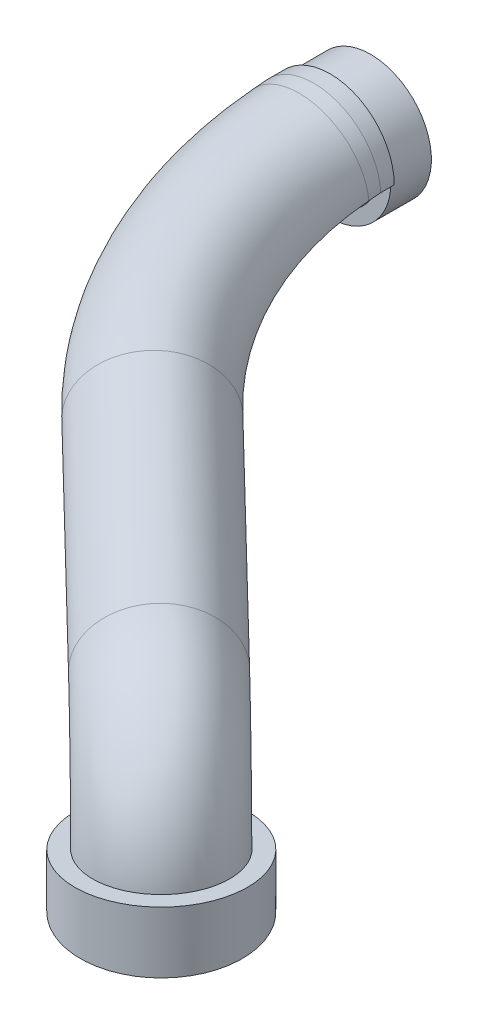
ISO-10303-21;
HEADER;
FILE_DESCRIPTION(('STEP AP214'),'2;1');
FILE_NAME('part.step','',(''),(''),'','','');
FILE_SCHEMA(('AUTOMOTIVE_DESIGN { 1 0 10303 214 1 1 1 1 }'));
ENDSEC;
DATA;
#1=APPLICATION_CONTEXT('core data for automotive mechanical design processes');
#2=APPLICATION_PROTOCOL_DEFINITION('international standard','automotive_design',2000,#1);
#3=PRODUCT_CONTEXT('',#1,'mechanical');
#4=PRODUCT('Part','Part','',(#3));
#5=PRODUCT_RELATED_PRODUCT_CATEGORY('part','',(#4));
#6=PRODUCT_DEFINITION_FORMATION('','',#4);
#7=PRODUCT_DEFINITION_CONTEXT('part definition',#1,'design');
#8=PRODUCT_DEFINITION('design','',#6,#7);
#9=PRODUCT_DEFINITION_SHAPE('','',#8);
#10=(LENGTH_UNIT() NAMED_UNIT(*) SI_UNIT(.MILLI.,.METRE.));
#11=(NAMED_UNIT(*) PLANE_ANGLE_UNIT() SI_UNIT($,.RADIAN.));
#12=(NAMED_UNIT(*) SI_UNIT($,.STERADIAN.) SOLID_ANGLE_UNIT());
#13=UNCERTAINTY_MEASURE_WITH_UNIT(LENGTH_MEASURE(1.E-05),#10,'distance_accuracy_value','');
#14=(GEOMETRIC_REPRESENTATION_CONTEXT(3) GLOBAL_UNCERTAINTY_ASSIGNED_CONTEXT((#13)) GLOBAL_UNIT_ASSIGNED_CONTEXT((#10,
#11,#12)) REPRESENTATION_CONTEXT('',''));
#15=CARTESIAN_POINT('',(0.,0.,0.));
#16=DIRECTION('',(0.,0.,1.));
#17=DIRECTION('',(1.,0.,0.));
#18=AXIS2_PLACEMENT_3D('',#15,#16,#17);
#19=CARTESIAN_POINT('',(0.,0.,0.));
#20=DIRECTION('',(0.,1.,0.));
#21=DIRECTION('',(0.,0.,1.));
#22=AXIS2_PLACEMENT_3D('',#19,#20,#21);
#23=PLANE('',#22);
#24=CARTESIAN_POINT('',(0.,0.,0.));
#25=DIRECTION('',(0.,1.,0.));
#26=DIRECTION('',(0.,0.,1.));
#27=AXIS2_PLACEMENT_3D('',#24,#25,#26);
#28=CIRCLE('',#27,7.);
#29=CARTESIAN_POINT('',(0.,0.,7.));
#30=VERTEX_POINT('',#29);
#31=EDGE_CURVE('E288',#30,#30,#28,.F.);
#32=ORIENTED_EDGE('',*,*,#31,.F.);
#33=EDGE_LOOP('',(#32));
#34=FACE_BOUND('',#33,.T.);
#35=CARTESIAN_POINT('',(0.,0.,0.));
#36=DIRECTION('',(0.,-1.,0.));
#37=DIRECTION('',(0.,0.,-1.));
#38=AXIS2_PLACEMENT_3D('',#35,#36,#37);
#39=CIRCLE('',#38,10.);
#40=CARTESIAN_POINT('',(0.,0.,-10.));
#41=VERTEX_POINT('',#40);
#42=EDGE_CURVE('E605',#41,#41,#39,.T.);
#43=ORIENTED_EDGE('',*,*,#42,.T.);
#44=EDGE_LOOP('',(#43));
#45=FACE_BOUND('',#44,.T.);
#46=ADVANCED_FACE('F33',(#34,#45),#23,.F.);
#47=CARTESIAN_POINT('',(-54.5,26.,-76.4564153262791));
#48=DIRECTION('',(0.,0.,-1.));
#49=DIRECTION('',(-1.,0.,0.));
#50=AXIS2_PLACEMENT_3D('',#47,#48,#49);
#51=CYLINDRICAL_SURFACE('',#50,9.5);
#52=CARTESIAN_POINT('',(-54.5,26.,-79.5));
#53=DIRECTION('',(0.,0.,-1.));
#54=DIRECTION('',(-0.657185367437751,0.753728991631414,0.));
#55=AXIS2_PLACEMENT_3D('',#52,#53,#54);
#56=CIRCLE('',#55,9.5);
#57=CARTESIAN_POINT('',(-64.,26.,-79.5));
#58=VERTEX_POINT('',#57);
#59=CARTESIAN_POINT('',(-45.,26.,-79.4999999999999));
#60=VERTEX_POINT('',#59);
#61=EDGE_CURVE('E244',#58,#60,#56,.T.);
#62=ORIENTED_EDGE('',*,*,#61,.F.);
#63=DIRECTION('',(0.,0.,1.));
#64=VECTOR('',#63,1.);
#65=CARTESIAN_POINT('',(-64.,26.,-79.5));
#66=LINE('',#65,#64);
#67=CARTESIAN_POINT('',(-64.,26.,-77.5));
#68=VERTEX_POINT('',#67);
#69=EDGE_CURVE('E207',#58,#68,#66,.T.);
#70=ORIENTED_EDGE('',*,*,#69,.T.);
#71=CARTESIAN_POINT('',(-54.5,26.,-77.5));
#72=DIRECTION('',(0.,0.0436193873653349,-0.999048221581858));
#73=DIRECTION('',(0.,0.999048221581858,0.0436193873653349));
#74=AXIS2_PLACEMENT_3D('',#71,#72,#73);
#75=ELLIPSE('',#74,9.50905050905154,9.5);
#76=CARTESIAN_POINT('',(-45.,26.0000000000004,-77.5));
#77=VERTEX_POINT('',#76);
#78=EDGE_CURVE('E246',#77,#68,#75,.F.);
#79=ORIENTED_EDGE('',*,*,#78,.F.);
#80=DIRECTION('',(0.,0.,1.));
#81=VECTOR('',#80,1.);
#82=CARTESIAN_POINT('',(-45.,26.,-79.4999999999999));
#83=LINE('',#82,#81);
#84=EDGE_CURVE('E51',#60,#77,#83,.T.);
#85=ORIENTED_EDGE('',*,*,#84,.F.);
#86=EDGE_LOOP('',(#62,#70,#79,#85));
#87=FACE_BOUND('',#86,.T.);
#88=ADVANCED_FACE('F35',(#87),#51,.T.);
#89=CARTESIAN_POINT('',(-10.7935507856496,1.64560190223517,-10.4162978758099));
#90=DIRECTION('',(-0.694419858387329,0.,0.719570052376641));
#91=DIRECTION('',(0.719570052376641,0.,0.694419858387329));
#92=AXIS2_PLACEMENT_3D('',#89,#90,#91);
#93=TOROIDAL_SURFACE('',#92,15.,9.5);
#94=CARTESIAN_POINT('',(-0.0440681042573176,2.999676316236,-0.0425278492576092));
#95=DIRECTION('',(-0.064956759800294,0.995917181923496,-0.0626864108544265));
#96=DIRECTION('',(-0.9978797390094,-0.0650847637664243,0.));
#97=AXIS2_PLACEMENT_3D('',#94,#95,#96);
#98=CIRCLE('',#97,9.5);
#99=CARTESIAN_POINT('',(7.11395712261174,3.0734267268114,-6.28810514270671));
#100=VERTEX_POINT('',#99);
#101=CARTESIAN_POINT('',(-7.2020933311263,2.9259259056606,6.20304944419147));
#102=VERTEX_POINT('',#101);
#103=EDGE_CURVE('E135',#100,#102,#98,.F.);
#104=ORIENTED_EDGE('',*,*,#103,.F.);
#105=CARTESIAN_POINT('',(-4.22100206806913,1.64560190223517,-17.2268882813618));
#106=DIRECTION('',(0.694419858387329,0.,-0.719570052376641));
#107=DIRECTION('',(0.0832428718841226,0.993286046595802,0.0803333923008654));
#108=AXIS2_PLACEMENT_3D('',#105,#106,#107);
#109=CIRCLE('',#108,15.8169832818588);
#110=CARTESIAN_POINT('',(-2.90435095514406,17.3563906953446,-15.956256358364));
#111=VERTEX_POINT('',#110);
#112=EDGE_CURVE('E147',#111,#100,#109,.T.);
#113=ORIENTED_EDGE('',*,*,#112,.F.);
#114=CARTESIAN_POINT('',(-9.54490770738781,16.5448926011722,-9.21129699129698));
#115=DIRECTION('',(-0.714738892573928,0.115684180586978,-0.689757555815167));
#116=DIRECTION('',(-0.441878230565624,0.689757555815168,0.573566163182661));
#117=AXIS2_PLACEMENT_3D('',#114,#115,#116);
#118=CIRCLE('',#117,9.5);
#119=CARTESIAN_POINT('',(-16.1854644596315,15.7333945069998,-2.46633762422999));
#120=VERTEX_POINT('',#119);
#121=EDGE_CURVE('E239',#120,#111,#118,.T.);
#122=ORIENTED_EDGE('',*,*,#121,.F.);
#123=CARTESIAN_POINT('',(-17.3660995032301,1.64560190223516,-3.60570747025813));
#124=DIRECTION('',(0.694419858387329,0.,-0.719570052376641));
#125=DIRECTION('',(0.0832428718841195,0.993286046595803,0.0803333923008626));
#126=AXIS2_PLACEMENT_3D('',#123,#124,#125);
#127=CIRCLE('',#126,14.1830167181412);
#128=EDGE_CURVE('E149',#120,#102,#127,.T.);
#129=ORIENTED_EDGE('',*,*,#128,.T.);
#130=EDGE_LOOP('',(#104,#113,#122,#129));
#131=FACE_BOUND('',#130,.T.);
#132=ADVANCED_FACE('F145',(#131),#93,.T.);
#133=CARTESIAN_POINT('',(-9.54490770738781,16.5448926011722,-9.21129699129699));
#134=DIRECTION('',(-0.714738892573929,0.115684180586978,-0.689757555815167));
#135=DIRECTION('',(-0.694419858387329,0.,0.719570052376641));
#136=AXIS2_PLACEMENT_3D('',#133,#134,#135);
#137=CYLINDRICAL_SURFACE('',#136,9.5);
#138=CARTESIAN_POINT('',(-37.8961597214898,21.1336891420391,-36.5716246532258));
#139=DIRECTION('',(-0.714738892573929,0.115684180586978,-0.689757555815168));
#140=DIRECTION('',(-0.441878230565625,0.689757555815168,0.573566163182661));
#141=AXIS2_PLACEMENT_3D('',#138,#139,#140);
#142=CIRCLE('',#141,9.5);
#143=CARTESIAN_POINT('',(-44.5367164737335,20.3221910478667,-29.8266652861588));
#144=VERTEX_POINT('',#143);
#145=CARTESIAN_POINT('',(-31.2556029692461,21.9451872362114,-43.3165840202928));
#146=VERTEX_POINT('',#145);
#147=EDGE_CURVE('E238',#144,#146,#142,.T.);
#148=ORIENTED_EDGE('',*,*,#147,.F.);
#149=DIRECTION('',(0.714738892573929,-0.115684180586978,0.689757555815167));
#150=VECTOR('',#149,1.);
#151=CARTESIAN_POINT('',(-44.5367164737335,20.3221910478668,-29.8266652861588));
#152=LINE('',#151,#150);
#153=EDGE_CURVE('E169',#144,#120,#152,.T.);
#154=ORIENTED_EDGE('',*,*,#153,.T.);
#155=ORIENTED_EDGE('',*,*,#121,.T.);
#156=DIRECTION('',(0.714738892573929,-0.115684180586978,0.689757555815167));
#157=VECTOR('',#156,1.);
#158=CARTESIAN_POINT('',(-31.2556029692461,21.9451872362115,-43.3165840202928));
#159=LINE('',#158,#157);
#160=EDGE_CURVE('E235',#146,#111,#159,.T.);
#161=ORIENTED_EDGE('',*,*,#160,.F.);
#162=EDGE_LOOP('',(#148,#154,#155,#161));
#163=FACE_BOUND('',#162,.T.);
#164=ADVANCED_FACE('F236',(#163),#137,.T.);
#165=CARTESIAN_POINT('',(0.337128858030514,21.632310441378,-76.1060023667421));
#166=DIRECTION('',(-0.0769013505835418,-0.993244673217161,-0.0868976490140093));
#167=DIRECTION('',(0.,0.087155742747655,-0.996194698091746));
#168=AXIS2_PLACEMENT_3D('',#165,#166,#167);
#169=TOROIDAL_SURFACE('',#168,55.,9.5);
#170=ORIENTED_EDGE('',*,*,#147,.T.);
#171=CARTESIAN_POINT('',(0.393310126385449,22.3579380812659,-76.0425181743108));
#172=DIRECTION('',(0.0769013505835418,0.993244673217161,0.0868976490140084));
#173=DIRECTION('',(-0.997038706509645,0.0766087177274189,0.00670239432840719));
#174=AXIS2_PLACEMENT_3D('',#171,#172,#173);
#175=CIRCLE('',#174,45.5281322881584);
#176=CARTESIAN_POINT('',(-45.,25.8457899163861,-75.7373706786797));
#177=VERTEX_POINT('',#176);
#178=EDGE_CURVE('E191',#177,#146,#175,.T.);
#179=ORIENTED_EDGE('',*,*,#178,.F.);
#180=CARTESIAN_POINT('',(-54.5,25.8457899163861,-75.7373706786796));
#181=DIRECTION('',(0.,0.0871557427476551,-0.996194698091746));
#182=DIRECTION('',(-0.657185367437751,0.750860825261252,0.0656918100960783));
#183=AXIS2_PLACEMENT_3D('',#180,#181,#182);
#184=CIRCLE('',#183,9.5);
#185=CARTESIAN_POINT('',(-64.,25.8457899163861,-75.7373706786797));
#186=VERTEX_POINT('',#185);
#187=EDGE_CURVE('E242',#186,#177,#184,.T.);
#188=ORIENTED_EDGE('',*,*,#187,.F.);
#189=CARTESIAN_POINT('',(0.280947589675565,20.90668280149,-76.1694865591733));
#190=DIRECTION('',(0.0769013505835418,0.993244673217161,0.0868976490140084));
#191=DIRECTION('',(-0.997038706509645,0.076608717727419,0.00670239432840603));
#192=AXIS2_PLACEMENT_3D('',#189,#190,#191);
#193=CIRCLE('',#192,64.4718677118416);
#194=EDGE_CURVE('E187',#186,#144,#193,.T.);
#195=ORIENTED_EDGE('',*,*,#194,.T.);
#196=EDGE_LOOP('',(#170,#179,#188,#195));
#197=FACE_BOUND('',#196,.T.);
#198=ADVANCED_FACE('F241',(#197),#169,.T.);
#199=CARTESIAN_POINT('',(-54.5,25.8457899163861,-75.7373706786796));
#200=DIRECTION('',(0.,0.087155742747656,-0.996194698091746));
#201=DIRECTION('',(0.,0.996194698091746,0.087155742747656));
#202=AXIS2_PLACEMENT_3D('',#199,#200,#201);
#203=CYLINDRICAL_SURFACE('',#202,9.5);
#204=ORIENTED_EDGE('',*,*,#78,.T.);
#205=DIRECTION('',(0.,-0.0871557427476548,0.996194698091746));
#206=VECTOR('',#205,1.);
#207=CARTESIAN_POINT('',(-64.,26.,-77.5));
#208=LINE('',#207,#206);
#209=EDGE_CURVE('E197',#68,#186,#208,.T.);
#210=ORIENTED_EDGE('',*,*,#209,.T.);
#211=ORIENTED_EDGE('',*,*,#187,.T.);
#212=DIRECTION('',(0.,-0.0871557427476548,0.996194698091746));
#213=VECTOR('',#212,1.);
#214=CARTESIAN_POINT('',(-45.,26.,-77.5));
#215=LINE('',#214,#213);
#216=EDGE_CURVE('E200',#77,#177,#215,.T.);
#217=ORIENTED_EDGE('',*,*,#216,.F.);
#218=EDGE_LOOP('',(#204,#210,#211,#217));
#219=FACE_BOUND('',#218,.T.);
#220=ADVANCED_FACE('F261',(#219),#203,.T.);
#221=CARTESIAN_POINT('',(-54.5,26.,-79.5));
#222=DIRECTION('',(0.,0.,-1.));
#223=DIRECTION('',(-0.657185367437751,0.753728991631414,0.));
#224=AXIS2_PLACEMENT_3D('',#221,#222,#223);
#225=PLANE('',#224);
#226=DIRECTION('',(1.,0.,0.));
#227=VECTOR('',#226,1.);
#228=CARTESIAN_POINT('',(-64.,26.,-79.5));
#229=LINE('',#228,#227);
#230=CARTESIAN_POINT('',(-63.5,26.,-79.5));
#231=VERTEX_POINT('',#230);
#232=EDGE_CURVE('E329',#58,#231,#229,.T.);
#233=ORIENTED_EDGE('',*,*,#232,.F.);
#234=ORIENTED_EDGE('',*,*,#61,.T.);
#235=CARTESIAN_POINT('',(-45.5,26.,-79.5));
#236=VERTEX_POINT('',#235);
#237=EDGE_CURVE('E37',#236,#60,#229,.T.);
#238=ORIENTED_EDGE('',*,*,#237,.F.);
#239=CARTESIAN_POINT('',(-54.5,26.,-79.5));
#240=DIRECTION('',(0.,0.,-1.));
#241=DIRECTION('',(-1.,0.,0.));
#242=AXIS2_PLACEMENT_3D('',#239,#240,#241);
#243=CIRCLE('',#242,9.);
#244=EDGE_CURVE('E284',#231,#236,#243,.T.);
#245=ORIENTED_EDGE('',*,*,#244,.F.);
#246=EDGE_LOOP('',(#233,#234,#238,#245));
#247=FACE_BOUND('',#246,.T.);
#248=ADVANCED_FACE('F345',(#247),#225,.T.);
#249=CARTESIAN_POINT('',(-54.5,26.,-76.7047270825214));
#250=DIRECTION('',(0.,0.,-1.));
#251=DIRECTION('',(-1.,0.,0.));
#252=AXIS2_PLACEMENT_3D('',#249,#250,#251);
#253=CYLINDRICAL_SURFACE('',#252,7.);
#254=CARTESIAN_POINT('',(-54.5,26.,-85.5));
#255=DIRECTION('',(0.,0.,-1.));
#256=DIRECTION('',(-1.,0.,0.));
#257=AXIS2_PLACEMENT_3D('',#254,#255,#256);
#258=CIRCLE('',#257,7.);
#259=CARTESIAN_POINT('',(-61.5,26.,-85.5));
#260=VERTEX_POINT('',#259);
#261=EDGE_CURVE('E268',#260,#260,#258,.T.);
#262=ORIENTED_EDGE('',*,*,#261,.T.);
#263=EDGE_LOOP('',(#262));
#264=FACE_BOUND('',#263,.T.);
#265=CARTESIAN_POINT('',(-54.5,26.,-77.5));
#266=DIRECTION('',(0.,0.0436193873653349,-0.999048221581858));
#267=DIRECTION('',(0.,0.999048221581858,0.0436193873653349));
#268=AXIS2_PLACEMENT_3D('',#265,#266,#267);
#269=ELLIPSE('',#268,7.00666879614324,7.);
#270=CARTESIAN_POINT('',(-61.5,26.,-77.5));
#271=VERTEX_POINT('',#270);
#272=CARTESIAN_POINT('',(-47.5,26.,-77.5));
#273=VERTEX_POINT('',#272);
#274=EDGE_CURVE('E276',#271,#273,#269,.T.);
#275=ORIENTED_EDGE('',*,*,#274,.F.);
#276=DIRECTION('',(0.,0.,-1.));
#277=VECTOR('',#276,1.);
#278=CARTESIAN_POINT('',(-61.5,26.,-76.7047270825215));
#279=LINE('',#278,#277);
#280=CARTESIAN_POINT('',(-61.5,26.,-79.5));
#281=VERTEX_POINT('',#280);
#282=EDGE_CURVE('E323',#271,#281,#279,.T.);
#283=ORIENTED_EDGE('',*,*,#282,.T.);
#284=CARTESIAN_POINT('',(-54.5,26.,-79.5));
#285=DIRECTION('',(0.,0.,-1.));
#286=DIRECTION('',(-1.,0.,0.));
#287=AXIS2_PLACEMENT_3D('',#284,#285,#286);
#288=CIRCLE('',#287,7.);
#289=CARTESIAN_POINT('',(-47.5,26.,-79.5));
#290=VERTEX_POINT('',#289);
#291=EDGE_CURVE('E328',#290,#281,#288,.T.);
#292=ORIENTED_EDGE('',*,*,#291,.F.);
#293=DIRECTION('',(0.,0.,-1.));
#294=VECTOR('',#293,1.);
#295=CARTESIAN_POINT('',(-47.5,26.,-76.7047270825214));
#296=LINE('',#295,#294);
#297=EDGE_CURVE('E326',#290,#273,#296,.F.);
#298=ORIENTED_EDGE('',*,*,#297,.T.);
#299=EDGE_LOOP('',(#275,#283,#292,#298));
#300=FACE_BOUND('',#299,.T.);
#301=ADVANCED_FACE('F351',(#264,#300),#253,.F.);
#302=CARTESIAN_POINT('',(-10.7935507856496,1.64560190223517,-10.4162978758099));
#303=DIRECTION('',(-0.694419858387329,0.,0.719570052376641));
#304=DIRECTION('',(0.719570052376641,0.,0.694419858387329));
#305=AXIS2_PLACEMENT_3D('',#302,#303,#304);
#306=TOROIDAL_SURFACE('',#305,15.,7.);
#307=CARTESIAN_POINT('',(0.,1.64560190223517,0.));
#308=DIRECTION('',(0.,1.,0.));
#309=DIRECTION('',(0.,0.,1.));
#310=AXIS2_PLACEMENT_3D('',#307,#308,#309);
#311=CIRCLE('',#310,7.);
#312=CARTESIAN_POINT('',(0.,1.64560190223517,7.));
#313=VERTEX_POINT('',#312);
#314=EDGE_CURVE('E292',#313,#313,#311,.F.);
#315=ORIENTED_EDGE('',*,*,#314,.T.);
#316=EDGE_LOOP('',(#315));
#317=FACE_BOUND('',#316,.T.);
#318=CARTESIAN_POINT('',(-0.0440681042573176,2.999676316236,-0.0425278492576092));
#319=DIRECTION('',(-0.064956759800294,0.995917181923496,-0.0626864108544265));
#320=DIRECTION('',(-0.9978797390094,-0.0650847637664243,0.));
#321=AXIS2_PLACEMENT_3D('',#318,#319,#320);
#322=CIRCLE('',#321,7.);
#323=CARTESIAN_POINT('',(5.23026627343597,3.05401872402839,-4.64453217074671));
#324=VERTEX_POINT('',#323);
#325=CARTESIAN_POINT('',(-5.31840248195058,2.94533390844359,4.55947647223147));
#326=VERTEX_POINT('',#325);
#327=EDGE_CURVE('E11',#324,#326,#322,.T.);
#328=ORIENTED_EDGE('',*,*,#327,.T.);
#329=CARTESIAN_POINT('',(-15.6364814196566,1.64560190223517,-5.39796810329777));
#330=DIRECTION('',(0.694419858387329,0.,-0.719570052376641));
#331=DIRECTION('',(-0.719570052376641,0.,-0.694419858387329));
#332=AXIS2_PLACEMENT_3D('',#329,#330,#331);
#333=CIRCLE('',#332,14.3980123186303);
#334=CARTESIAN_POINT('',(-14.4379495248305,15.9469466370452,-4.24132693135288));
#335=VERTEX_POINT('',#334);
#336=EDGE_CURVE('E307',#326,#335,#333,.F.);
#337=ORIENTED_EDGE('',*,*,#336,.T.);
#338=CARTESIAN_POINT('',(-9.54490770738781,16.5448926011722,-9.21129699129698));
#339=DIRECTION('',(-0.714738892573928,0.115684180586978,-0.689757555815167));
#340=DIRECTION('',(-0.441878230565624,0.689757555815168,0.573566163182661));
#341=AXIS2_PLACEMENT_3D('',#338,#339,#340);
#342=CIRCLE('',#341,7.);
#343=CARTESIAN_POINT('',(-4.65186588994504,17.1428385652992,-14.1812670512411));
#344=VERTEX_POINT('',#343);
#345=EDGE_CURVE('E295',#344,#335,#342,.F.);
#346=ORIENTED_EDGE('',*,*,#345,.F.);
#347=CARTESIAN_POINT('',(-5.95062015164264,1.64560190223517,-15.4346276483221));
#348=DIRECTION('',(-0.694419858387329,0.,0.719570052376641));
#349=DIRECTION('',(0.719570052376641,0.,0.694419858387329));
#350=AXIS2_PLACEMENT_3D('',#347,#348,#349);
#351=CIRCLE('',#350,15.6019876813697);
#352=EDGE_CURVE('E310',#344,#324,#351,.F.);
#353=ORIENTED_EDGE('',*,*,#352,.T.);
#354=EDGE_LOOP('',(#328,#337,#346,#353));
#355=FACE_BOUND('',#354,.T.);
#356=ADVANCED_FACE('F373',(#317,#355),#306,.F.);
#357=CARTESIAN_POINT('',(-9.54490770738781,16.5448926011722,-9.21129699129699));
#358=DIRECTION('',(-0.714738892573929,0.115684180586978,-0.689757555815167));
#359=DIRECTION('',(-0.694419858387329,0.,0.719570052376641));
#360=AXIS2_PLACEMENT_3D('',#357,#358,#359);
#361=CYLINDRICAL_SURFACE('',#360,7.);
#362=ORIENTED_EDGE('',*,*,#345,.T.);
#363=DIRECTION('',(-0.714738892573929,0.115684180586978,-0.689757555815167));
#364=VECTOR('',#363,1.);
#365=CARTESIAN_POINT('',(-14.4379495248305,15.9469466370452,-4.24132693135287));
#366=LINE('',#365,#364);
#367=CARTESIAN_POINT('',(-42.7892015389325,20.5357431779121,-31.6016545932817));
#368=VERTEX_POINT('',#367);
#369=EDGE_CURVE('E312',#335,#368,#366,.T.);
#370=ORIENTED_EDGE('',*,*,#369,.T.);
#371=CARTESIAN_POINT('',(-37.8961597214898,21.1336891420391,-36.5716246532258));
#372=DIRECTION('',(-0.714738892573929,0.115684180586978,-0.689757555815168));
#373=DIRECTION('',(-0.441878230565625,0.689757555815168,0.573566163182661));
#374=AXIS2_PLACEMENT_3D('',#371,#372,#373);
#375=CIRCLE('',#374,7.);
#376=CARTESIAN_POINT('',(-33.003117904047,21.7316351061661,-41.5415947131699));
#377=VERTEX_POINT('',#376);
#378=EDGE_CURVE('E298',#377,#368,#375,.F.);
#379=ORIENTED_EDGE('',*,*,#378,.F.);
#380=DIRECTION('',(-0.714738892573929,0.115684180586978,-0.689757555815167));
#381=VECTOR('',#380,1.);
#382=CARTESIAN_POINT('',(-4.65186588994508,17.1428385652992,-14.1812670512411));
#383=LINE('',#382,#381);
#384=EDGE_CURVE('E315',#377,#344,#383,.F.);
#385=ORIENTED_EDGE('',*,*,#384,.T.);
#386=EDGE_LOOP('',(#362,#370,#379,#385));
#387=FACE_BOUND('',#386,.T.);
#388=ADVANCED_FACE('F370',(#387),#361,.F.);
#389=CARTESIAN_POINT('',(0.337128858030514,21.632310441378,-76.1060023667421));
#390=DIRECTION('',(-0.0769013505835418,-0.993244673217161,-0.0868976490140093));
#391=DIRECTION('',(0.,0.087155742747655,-0.996194698091746));
#392=AXIS2_PLACEMENT_3D('',#389,#390,#391);
#393=TOROIDAL_SURFACE('',#392,55.,7.);
#394=CARTESIAN_POINT('',(-54.5,25.8457899163861,-75.7373706786796));
#395=DIRECTION('',(0.,0.0871557427476551,-0.996194698091746));
#396=DIRECTION('',(-0.657185367437751,0.750860825261252,0.0656918100960783));
#397=AXIS2_PLACEMENT_3D('',#394,#395,#396);
#398=CIRCLE('',#397,7.);
#399=CARTESIAN_POINT('',(-47.5,25.845789916386,-75.7373706786796));
#400=VERTEX_POINT('',#399);
#401=CARTESIAN_POINT('',(-61.5,25.8457899163861,-75.7373706786797));
#402=VERTEX_POINT('',#401);
#403=EDGE_CURVE('E287',#400,#402,#398,.F.);
#404=ORIENTED_EDGE('',*,*,#403,.F.);
#405=CARTESIAN_POINT('',(0.378525582081516,22.1669834391901,-76.0592245407401));
#406=DIRECTION('',(-0.0769013505835418,-0.993244673217161,-0.0868976490140084));
#407=DIRECTION('',(0.,0.087155742747654,-0.996194698091746));
#408=AXIS2_PLACEMENT_3D('',#405,#406,#407);
#409=CIRCLE('',#408,48.0207290544325);
#410=EDGE_CURVE('E318',#400,#377,#409,.F.);
#411=ORIENTED_EDGE('',*,*,#410,.T.);
#412=ORIENTED_EDGE('',*,*,#378,.T.);
#413=CARTESIAN_POINT('',(0.295732133979497,21.0976374435658,-76.152780192744));
#414=DIRECTION('',(0.0769013505835418,0.993244673217161,0.0868976490140084));
#415=DIRECTION('',(0.,-0.087155742747654,0.996194698091746));
#416=AXIS2_PLACEMENT_3D('',#413,#414,#415);
#417=CIRCLE('',#416,61.9792709455675);
#418=EDGE_CURVE('E320',#368,#402,#417,.F.);
#419=ORIENTED_EDGE('',*,*,#418,.T.);
#420=EDGE_LOOP('',(#404,#411,#412,#419));
#421=FACE_BOUND('',#420,.T.);
#422=ADVANCED_FACE('F361',(#421),#393,.F.);
#423=CARTESIAN_POINT('',(-54.5,25.8457899163861,-75.7373706786796));
#424=DIRECTION('',(0.,0.087155742747656,-0.996194698091746));
#425=DIRECTION('',(0.,0.996194698091746,0.087155742747656));
#426=AXIS2_PLACEMENT_3D('',#423,#424,#425);
#427=CYLINDRICAL_SURFACE('',#426,7.);
#428=ORIENTED_EDGE('',*,*,#403,.T.);
#429=DIRECTION('',(0.,0.087155742747656,-0.996194698091746));
#430=VECTOR('',#429,1.);
#431=CARTESIAN_POINT('',(-61.5,25.8457899163861,-75.7373706786796));
#432=LINE('',#431,#430);
#433=EDGE_CURVE('E43',#402,#271,#432,.T.);
#434=ORIENTED_EDGE('',*,*,#433,.T.);
#435=ORIENTED_EDGE('',*,*,#274,.T.);
#436=DIRECTION('',(0.,0.087155742747656,-0.996194698091746));
#437=VECTOR('',#436,1.);
#438=CARTESIAN_POINT('',(-47.5,25.8457899163861,-75.7373706786796));
#439=LINE('',#438,#437);
#440=EDGE_CURVE('E281',#273,#400,#439,.F.);
#441=ORIENTED_EDGE('',*,*,#440,.T.);
#442=EDGE_LOOP('',(#428,#434,#435,#441));
#443=FACE_BOUND('',#442,.T.);
#444=ADVANCED_FACE('F358',(#443),#427,.F.);
#445=CARTESIAN_POINT('',(0.,0.,0.));
#446=DIRECTION('',(0.,1.,0.));
#447=DIRECTION('',(0.,0.,1.));
#448=AXIS2_PLACEMENT_3D('',#445,#446,#447);
#449=CYLINDRICAL_SURFACE('',#448,7.);
#450=ORIENTED_EDGE('',*,*,#314,.F.);
#451=EDGE_LOOP('',(#450));
#452=FACE_BOUND('',#451,.T.);
#453=ORIENTED_EDGE('',*,*,#31,.T.);
#454=EDGE_LOOP('',(#453));
#455=FACE_BOUND('',#454,.T.);
#456=ADVANCED_FACE('F448',(#452,#455),#449,.F.);
#457=CARTESIAN_POINT('',(-54.5,26.,-85.5));
#458=DIRECTION('',(0.,0.,-1.));
#459=DIRECTION('',(-1.,0.,0.));
#460=AXIS2_PLACEMENT_3D('',#457,#458,#459);
#461=PLANE('',#460);
#462=CARTESIAN_POINT('',(-54.5,26.,-85.5));
#463=DIRECTION('',(0.,0.,-1.));
#464=DIRECTION('',(-1.,0.,0.));
#465=AXIS2_PLACEMENT_3D('',#462,#463,#464);
#466=CIRCLE('',#465,9.);
#467=CARTESIAN_POINT('',(-63.5,26.,-85.5));
#468=VERTEX_POINT('',#467);
#469=EDGE_CURVE('E266',#468,#468,#466,.T.);
#470=ORIENTED_EDGE('',*,*,#469,.T.);
#471=EDGE_LOOP('',(#470));
#472=FACE_BOUND('',#471,.T.);
#473=ORIENTED_EDGE('',*,*,#261,.F.);
#474=EDGE_LOOP('',(#473));
#475=FACE_BOUND('',#474,.T.);
#476=ADVANCED_FACE('F385',(#472,#475),#461,.T.);
#477=CARTESIAN_POINT('',(-54.5,26.,-85.5));
#478=DIRECTION('',(0.,0.,1.));
#479=DIRECTION('',(1.,0.,0.));
#480=AXIS2_PLACEMENT_3D('',#477,#478,#479);
#481=CYLINDRICAL_SURFACE('',#480,9.);
#482=ORIENTED_EDGE('',*,*,#469,.F.);
#483=EDGE_LOOP('',(#482));
#484=FACE_BOUND('',#483,.T.);
#485=ORIENTED_EDGE('',*,*,#244,.T.);
#486=EDGE_CURVE('E291',#236,#231,#243,.T.);
#487=ORIENTED_EDGE('',*,*,#486,.T.);
#488=EDGE_LOOP('',(#485,#487));
#489=FACE_BOUND('',#488,.T.);
#490=ADVANCED_FACE('F347',(#484,#489),#481,.T.);
#491=CARTESIAN_POINT('',(-17.3660995032301,1.64560190223516,-3.60570747025813));
#492=DIRECTION('',(0.694419858387329,0.,-0.719570052376641));
#493=DIRECTION('',(-0.719570052376641,0.,-0.694419858387329));
#494=AXIS2_PLACEMENT_3D('',#491,#492,#493);
#495=CONICAL_SURFACE('',#494,14.1830167181412,0.0861045973664231);
#496=DIRECTION('',(0.753476339670421,0.00776320111319928,-0.657429188784115));
#497=VECTOR('',#496,1.);
#498=CARTESIAN_POINT('',(-7.2020933311263,2.9259259056606,6.20304944419147));
#499=LINE('',#498,#497);
#500=EDGE_CURVE('E140',#102,#326,#499,.T.);
#501=ORIENTED_EDGE('',*,*,#500,.F.);
#502=ORIENTED_EDGE('',*,*,#128,.F.);
#503=DIRECTION('',(0.699005973920393,0.0854208520181439,-0.709995722849157));
#504=VECTOR('',#503,1.);
#505=CARTESIAN_POINT('',(-16.1854644596315,15.7333945069998,-2.46633762422999));
#506=LINE('',#505,#504);
#507=EDGE_CURVE('E157',#120,#335,#506,.T.);
#508=ORIENTED_EDGE('',*,*,#507,.T.);
#509=ORIENTED_EDGE('',*,*,#336,.F.);
#510=EDGE_LOOP('',(#501,#502,#508,#509));
#511=FACE_BOUND('',#510,.T.);
#512=ADVANCED_FACE('F376',(#511),#495,.F.);
#513=CARTESIAN_POINT('',(-44.5367164737335,20.3221910478668,-29.8266652861588));
#514=DIRECTION('',(-0.0232155953143795,-0.989606208752964,-0.141917538492553));
#515=DIRECTION('',(0.,0.141955798171271,-0.989872997593912));
#516=AXIS2_PLACEMENT_3D('',#513,#514,#515);
#517=PLANE('',#516);
#518=ORIENTED_EDGE('',*,*,#507,.F.);
#519=ORIENTED_EDGE('',*,*,#153,.F.);
#520=DIRECTION('',(0.699005973920393,0.085420852018144,-0.709995722849158));
#521=VECTOR('',#520,1.);
#522=CARTESIAN_POINT('',(-44.5367164737335,20.3221910478667,-29.8266652861588));
#523=LINE('',#522,#521);
#524=EDGE_CURVE('E184',#144,#368,#523,.T.);
#525=ORIENTED_EDGE('',*,*,#524,.T.);
#526=ORIENTED_EDGE('',*,*,#369,.F.);
#527=EDGE_LOOP('',(#518,#519,#525,#526));
#528=FACE_BOUND('',#527,.T.);
#529=ADVANCED_FACE('F368',(#528),#517,.T.);
#530=CARTESIAN_POINT('',(-64.,26.,-77.5));
#531=DIRECTION('',(0.,-0.996194698091746,-0.0871557427476548));
#532=DIRECTION('',(0.,0.0871557427476548,-0.996194698091746));
#533=AXIS2_PLACEMENT_3D('',#530,#531,#532);
#534=PLANE('',#533);
#535=DIRECTION('',(1.,0.,0.));
#536=VECTOR('',#535,1.);
#537=CARTESIAN_POINT('',(-64.,25.8457899163861,-75.7373706786797));
#538=LINE('',#537,#536);
#539=EDGE_CURVE('E194',#186,#402,#538,.T.);
#540=ORIENTED_EDGE('',*,*,#539,.F.);
#541=ORIENTED_EDGE('',*,*,#209,.F.);
#542=DIRECTION('',(1.,0.,0.));
#543=VECTOR('',#542,1.);
#544=CARTESIAN_POINT('',(-64.,26.,-77.5));
#545=LINE('',#544,#543);
#546=EDGE_CURVE('E203',#68,#271,#545,.T.);
#547=ORIENTED_EDGE('',*,*,#546,.T.);
#548=ORIENTED_EDGE('',*,*,#433,.F.);
#549=EDGE_LOOP('',(#540,#541,#547,#548));
#550=FACE_BOUND('',#549,.T.);
#551=ADVANCED_FACE('F356',(#550),#534,.T.);
#552=CARTESIAN_POINT('',(0.280947589675565,20.90668280149,-76.1694865591733));
#553=DIRECTION('',(-0.0769013505835418,-0.993244673217161,-0.0868976490140084));
#554=DIRECTION('',(0.,0.087155742747654,-0.996194698091746));
#555=AXIS2_PLACEMENT_3D('',#552,#553,#554);
#556=CONICAL_SURFACE('',#555,64.4718677118416,1.49381897702508);
#557=EDGE_CURVE('E59',#400,#177,#538,.T.);
#558=ORIENTED_EDGE('',*,*,#557,.T.);
#559=ORIENTED_EDGE('',*,*,#178,.T.);
#560=EDGE_CURVE('E180',#377,#146,#523,.T.);
#561=ORIENTED_EDGE('',*,*,#560,.F.);
#562=ORIENTED_EDGE('',*,*,#410,.F.);
#563=EDGE_LOOP('',(#558,#559,#561,#562));
#564=FACE_BOUND('',#563,.T.);
#565=ADVANCED_FACE('F227',(#564),#556,.F.);
#566=CARTESIAN_POINT('',(-64.,26.,-79.5));
#567=DIRECTION('',(0.,-1.,0.));
#568=DIRECTION('',(0.,0.,-1.));
#569=AXIS2_PLACEMENT_3D('',#566,#567,#568);
#570=PLANE('',#569);
#571=ORIENTED_EDGE('',*,*,#546,.F.);
#572=ORIENTED_EDGE('',*,*,#69,.F.);
#573=ORIENTED_EDGE('',*,*,#232,.T.);
#574=EDGE_CURVE('E335',#231,#281,#229,.T.);
#575=ORIENTED_EDGE('',*,*,#574,.T.);
#576=ORIENTED_EDGE('',*,*,#282,.F.);
#577=EDGE_LOOP('',(#571,#572,#573,#575,#576));
#578=FACE_BOUND('',#577,.T.);
#579=ADVANCED_FACE('F353',(#578),#570,.T.);
#580=CARTESIAN_POINT('',(-54.5,26.,-79.5));
#581=DIRECTION('',(0.,0.,-1.));
#582=DIRECTION('',(-1.,0.,0.));
#583=AXIS2_PLACEMENT_3D('',#580,#581,#582);
#584=PLANE('',#583);
#585=EDGE_CURVE('E212',#290,#236,#229,.T.);
#586=ORIENTED_EDGE('',*,*,#585,.F.);
#587=ORIENTED_EDGE('',*,*,#291,.T.);
#588=ORIENTED_EDGE('',*,*,#574,.F.);
#589=ORIENTED_EDGE('',*,*,#486,.F.);
#590=EDGE_LOOP('',(#586,#587,#588,#589));
#591=FACE_BOUND('',#590,.T.);
#592=ADVANCED_FACE('F348',(#591),#584,.F.);
#593=CARTESIAN_POINT('',(-0.044068104257302,2.999676316236,-0.0425278492576231));
#594=DIRECTION('',(-0.064956759800294,0.995917181923496,-0.0626864108544265));
#595=DIRECTION('',(-0.753476339670421,-0.00776320111319946,0.657429188784115));
#596=AXIS2_PLACEMENT_3D('',#593,#594,#595);
#597=PLANE('',#596);
#598=ORIENTED_EDGE('',*,*,#500,.T.);
#599=ORIENTED_EDGE('',*,*,#327,.F.);
#600=EDGE_CURVE('E131',#324,#100,#499,.T.);
#601=ORIENTED_EDGE('',*,*,#600,.T.);
#602=ORIENTED_EDGE('',*,*,#103,.T.);
#603=EDGE_LOOP('',(#598,#599,#601,#602));
#604=FACE_BOUND('',#603,.T.);
#605=CARTESIAN_POINT('',(0.,3.0052274198767,0.));
#606=DIRECTION('',(-0.064956759800294,0.995917181923496,-0.0626864108544265));
#607=DIRECTION('',(-0.716632178759461,-0.0902716276000552,-0.691584668436849));
#608=AXIS2_PLACEMENT_3D('',#605,#606,#607);
#609=ELLIPSE('',#608,12.0491946698052,12.);
#610=CARTESIAN_POINT('',(-8.63484062851938,1.91752700576348,-8.33303830064828));
#611=VERTEX_POINT('',#610);
#612=EDGE_CURVE('E150',#611,#611,#609,.F.);
#613=ORIENTED_EDGE('',*,*,#612,.F.);
#614=EDGE_LOOP('',(#613));
#615=FACE_BOUND('',#614,.T.);
#616=ADVANCED_FACE('F133',(#604,#615),#597,.T.);
#617=EDGE_CURVE('E208',#273,#77,#545,.T.);
#618=ORIENTED_EDGE('',*,*,#617,.T.);
#619=ORIENTED_EDGE('',*,*,#216,.T.);
#620=ORIENTED_EDGE('',*,*,#557,.F.);
#621=ORIENTED_EDGE('',*,*,#440,.F.);
#622=EDGE_LOOP('',(#618,#619,#620,#621));
#623=FACE_BOUND('',#622,.T.);
#624=ADVANCED_FACE('F257',(#623),#534,.T.);
#625=ORIENTED_EDGE('',*,*,#524,.F.);
#626=ORIENTED_EDGE('',*,*,#194,.F.);
#627=ORIENTED_EDGE('',*,*,#539,.T.);
#628=ORIENTED_EDGE('',*,*,#418,.F.);
#629=EDGE_LOOP('',(#625,#626,#627,#628));
#630=FACE_BOUND('',#629,.T.);
#631=ADVANCED_FACE('F365',(#630),#556,.F.);
#632=ORIENTED_EDGE('',*,*,#560,.T.);
#633=ORIENTED_EDGE('',*,*,#160,.T.);
#634=EDGE_CURVE('E154',#344,#111,#506,.T.);
#635=ORIENTED_EDGE('',*,*,#634,.F.);
#636=ORIENTED_EDGE('',*,*,#384,.F.);
#637=EDGE_LOOP('',(#632,#633,#635,#636));
#638=FACE_BOUND('',#637,.T.);
#639=ADVANCED_FACE('F384',(#638),#517,.T.);
#640=ORIENTED_EDGE('',*,*,#634,.T.);
#641=ORIENTED_EDGE('',*,*,#112,.T.);
#642=ORIENTED_EDGE('',*,*,#600,.F.);
#643=ORIENTED_EDGE('',*,*,#352,.F.);
#644=EDGE_LOOP('',(#640,#641,#642,#643));
#645=FACE_BOUND('',#644,.T.);
#646=ADVANCED_FACE('F152',(#645),#495,.F.);
#647=ORIENTED_EDGE('',*,*,#585,.T.);
#648=ORIENTED_EDGE('',*,*,#237,.T.);
#649=ORIENTED_EDGE('',*,*,#84,.T.);
#650=ORIENTED_EDGE('',*,*,#617,.F.);
#651=ORIENTED_EDGE('',*,*,#297,.F.);
#652=EDGE_LOOP('',(#647,#648,#649,#650,#651));
#653=FACE_BOUND('',#652,.T.);
#654=ADVANCED_FACE('F342',(#653),#570,.T.);
#655=CARTESIAN_POINT('',(0.,37.015924686066,0.));
#656=DIRECTION('',(0.,-1.,0.));
#657=DIRECTION('',(0.,0.,-1.));
#658=AXIS2_PLACEMENT_3D('',#655,#656,#657);
#659=CYLINDRICAL_SURFACE('',#658,12.);
#660=ORIENTED_EDGE('',*,*,#612,.T.);
#661=EDGE_LOOP('',(#660));
#662=FACE_BOUND('',#661,.T.);
#663=CARTESIAN_POINT('',(0.,-5.,0.));
#664=DIRECTION('',(0.,-1.,0.));
#665=DIRECTION('',(0.,0.,-1.));
#666=AXIS2_PLACEMENT_3D('',#663,#664,#665);
#667=CIRCLE('',#666,12.);
#668=CARTESIAN_POINT('',(0.,-5.,-12.));
#669=VERTEX_POINT('',#668);
#670=EDGE_CURVE('E607',#669,#669,#667,.T.);
#671=ORIENTED_EDGE('',*,*,#670,.F.);
#672=EDGE_LOOP('',(#671));
#673=FACE_BOUND('',#672,.T.);
#674=ADVANCED_FACE('F538',(#662,#673),#659,.T.);
#675=CARTESIAN_POINT('',(0.,-5.,0.));
#676=DIRECTION('',(0.,-1.,0.));
#677=DIRECTION('',(0.,0.,-1.));
#678=AXIS2_PLACEMENT_3D('',#675,#676,#677);
#679=PLANE('',#678);
#680=ORIENTED_EDGE('',*,*,#670,.T.);
#681=EDGE_LOOP('',(#680));
#682=FACE_BOUND('',#681,.T.);
#683=CARTESIAN_POINT('',(0.,-5.,0.));
#684=DIRECTION('',(0.,-1.,0.));
#685=DIRECTION('',(0.,0.,-1.));
#686=AXIS2_PLACEMENT_3D('',#683,#684,#685);
#687=CIRCLE('',#686,10.);
#688=CARTESIAN_POINT('',(0.,-5.,-10.));
#689=VERTEX_POINT('',#688);
#690=EDGE_CURVE('E602',#689,#689,#687,.T.);
#691=ORIENTED_EDGE('',*,*,#690,.F.);
#692=EDGE_LOOP('',(#691));
#693=FACE_BOUND('',#692,.T.);
#694=ADVANCED_FACE('F575',(#682,#693),#679,.T.);
#695=CARTESIAN_POINT('',(0.,-5.,0.));
#696=DIRECTION('',(0.,1.,0.));
#697=DIRECTION('',(0.,0.,1.));
#698=AXIS2_PLACEMENT_3D('',#695,#696,#697);
#699=CYLINDRICAL_SURFACE('',#698,10.);
#700=ORIENTED_EDGE('',*,*,#690,.T.);
#701=EDGE_LOOP('',(#700));
#702=FACE_BOUND('',#701,.T.);
#703=ORIENTED_EDGE('',*,*,#42,.F.);
#704=EDGE_LOOP('',(#703));
#705=FACE_BOUND('',#704,.T.);
#706=ADVANCED_FACE('F585',(#702,#705),#699,.F.);
#707=CLOSED_SHELL('',(#46,#88,#132,#164,#198,#220,#248,#301,#356,#388,#422,#444,#456,#476,#490,
#512,#529,#551,#565,#579,#592,#616,#624,#631,#639,#646,#654,#674,#694,#706));
#708=MANIFOLD_SOLID_BREP('B2',#707);
#709=ADVANCED_BREP_SHAPE_REPRESENTATION('',(#18,#708),#14);
#710=SHAPE_DEFINITION_REPRESENTATION(#9,#709);
ENDSEC;
END-ISO-10303-21;
